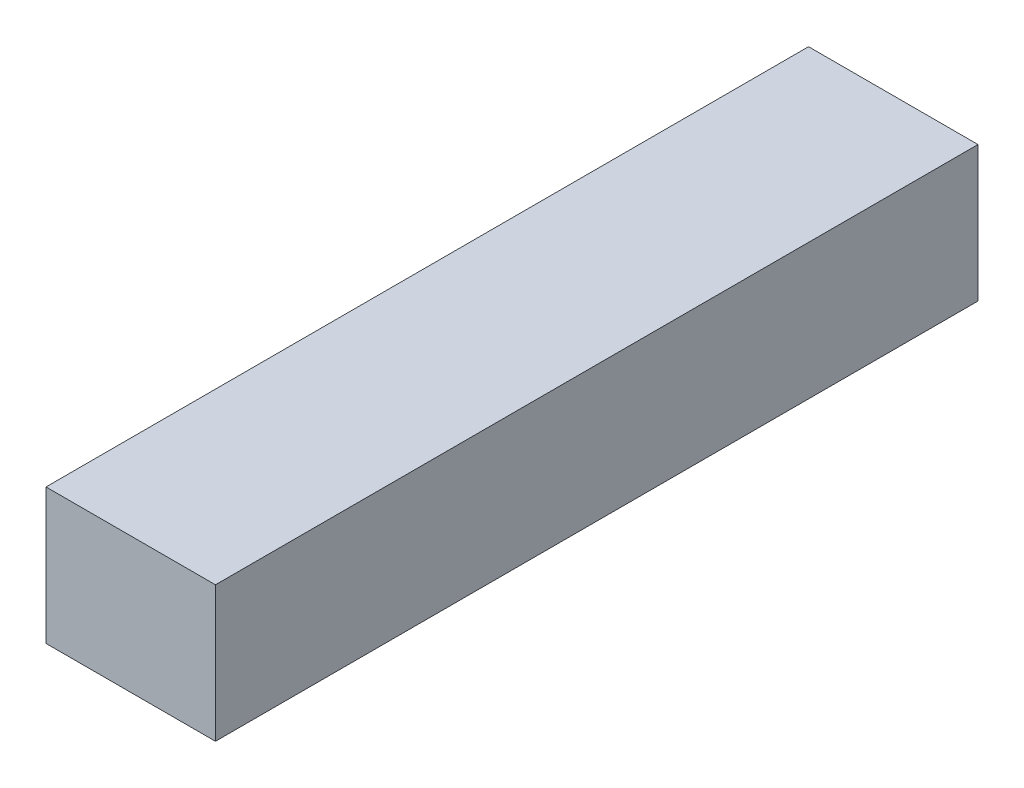
ISO-10303-21;
HEADER;
FILE_DESCRIPTION(('STEP AP214'),'2;1');
FILE_NAME('part.step','',(''),(''),'','','');
FILE_SCHEMA(('AUTOMOTIVE_DESIGN { 1 0 10303 214 1 1 1 1 }'));
ENDSEC;
DATA;
#1=APPLICATION_CONTEXT('core data for automotive mechanical design processes');
#2=APPLICATION_PROTOCOL_DEFINITION('international standard','automotive_design',2000,#1);
#3=PRODUCT_CONTEXT('',#1,'mechanical');
#4=PRODUCT('Part','Part','',(#3));
#5=PRODUCT_RELATED_PRODUCT_CATEGORY('part','',(#4));
#6=PRODUCT_DEFINITION_FORMATION('','',#4);
#7=PRODUCT_DEFINITION_CONTEXT('part definition',#1,'design');
#8=PRODUCT_DEFINITION('design','',#6,#7);
#9=PRODUCT_DEFINITION_SHAPE('','',#8);
#10=(LENGTH_UNIT() NAMED_UNIT(*) SI_UNIT(.MILLI.,.METRE.));
#11=(NAMED_UNIT(*) PLANE_ANGLE_UNIT() SI_UNIT($,.RADIAN.));
#12=(NAMED_UNIT(*) SI_UNIT($,.STERADIAN.) SOLID_ANGLE_UNIT());
#13=UNCERTAINTY_MEASURE_WITH_UNIT(LENGTH_MEASURE(1.E-05),#10,'distance_accuracy_value','');
#14=(GEOMETRIC_REPRESENTATION_CONTEXT(3) GLOBAL_UNCERTAINTY_ASSIGNED_CONTEXT((#13)) GLOBAL_UNIT_ASSIGNED_CONTEXT((#10,
#11,#12)) REPRESENTATION_CONTEXT('',''));
#15=CARTESIAN_POINT('',(0.,0.,0.));
#16=DIRECTION('',(0.,0.,1.));
#17=DIRECTION('',(1.,0.,0.));
#18=AXIS2_PLACEMENT_3D('',#15,#16,#17);
#19=CARTESIAN_POINT('',(0.,0.,45.));
#20=DIRECTION('',(1.,0.,0.));
#21=DIRECTION('',(0.,1.,0.));
#22=AXIS2_PLACEMENT_3D('',#19,#20,#21);
#23=PLANE('',#22);
#24=DIRECTION('',(0.,-1.,0.));
#25=VECTOR('',#24,1.);
#26=CARTESIAN_POINT('',(0.,0.,0.));
#27=LINE('',#26,#25);
#28=CARTESIAN_POINT('',(0.,0.,0.));
#29=VERTEX_POINT('',#28);
#30=CARTESIAN_POINT('',(0.,-8.,0.));
#31=VERTEX_POINT('',#30);
#32=EDGE_CURVE('E110',#29,#31,#27,.T.);
#33=ORIENTED_EDGE('',*,*,#32,.T.);
#34=DIRECTION('',(0.,0.,-1.));
#35=VECTOR('',#34,1.);
#36=CARTESIAN_POINT('',(0.,-8.,45.));
#37=LINE('',#36,#35);
#38=CARTESIAN_POINT('',(0.,-8.,45.));
#39=VERTEX_POINT('',#38);
#40=EDGE_CURVE('E11',#39,#31,#37,.T.);
#41=ORIENTED_EDGE('',*,*,#40,.F.);
#42=DIRECTION('',(0.,-1.,0.));
#43=VECTOR('',#42,1.);
#44=CARTESIAN_POINT('',(0.,0.,45.));
#45=LINE('',#44,#43);
#46=CARTESIAN_POINT('',(0.,0.,45.));
#47=VERTEX_POINT('',#46);
#48=EDGE_CURVE('E94',#47,#39,#45,.T.);
#49=ORIENTED_EDGE('',*,*,#48,.F.);
#50=DIRECTION('',(0.,0.,-1.));
#51=VECTOR('',#50,1.);
#52=CARTESIAN_POINT('',(0.,0.,45.));
#53=LINE('',#52,#51);
#54=EDGE_CURVE('E106',#47,#29,#53,.T.);
#55=ORIENTED_EDGE('',*,*,#54,.T.);
#56=EDGE_LOOP('',(#33,#41,#49,#55));
#57=FACE_BOUND('',#56,.T.);
#58=ADVANCED_FACE('F42',(#57),#23,.F.);
#59=CARTESIAN_POINT('',(0.,-8.,45.));
#60=DIRECTION('',(0.,1.,0.));
#61=DIRECTION('',(0.,0.,1.));
#62=AXIS2_PLACEMENT_3D('',#59,#60,#61);
#63=PLANE('',#62);
#64=DIRECTION('',(1.,0.,0.));
#65=VECTOR('',#64,1.);
#66=CARTESIAN_POINT('',(0.,-8.,0.));
#67=LINE('',#66,#65);
#68=CARTESIAN_POINT('',(10.,-8.,0.));
#69=VERTEX_POINT('',#68);
#70=EDGE_CURVE('E99',#31,#69,#67,.T.);
#71=ORIENTED_EDGE('',*,*,#70,.T.);
#72=DIRECTION('',(0.,0.,-1.));
#73=VECTOR('',#72,1.);
#74=CARTESIAN_POINT('',(10.,-8.,45.));
#75=LINE('',#74,#73);
#76=CARTESIAN_POINT('',(10.,-8.,45.));
#77=VERTEX_POINT('',#76);
#78=EDGE_CURVE('E51',#77,#69,#75,.T.);
#79=ORIENTED_EDGE('',*,*,#78,.F.);
#80=DIRECTION('',(1.,0.,0.));
#81=VECTOR('',#80,1.);
#82=CARTESIAN_POINT('',(0.,-8.,45.));
#83=LINE('',#82,#81);
#84=EDGE_CURVE('E89',#39,#77,#83,.T.);
#85=ORIENTED_EDGE('',*,*,#84,.F.);
#86=ORIENTED_EDGE('',*,*,#40,.T.);
#87=EDGE_LOOP('',(#71,#79,#85,#86));
#88=FACE_BOUND('',#87,.T.);
#89=ADVANCED_FACE('F98',(#88),#63,.F.);
#90=CARTESIAN_POINT('',(10.,0.,45.));
#91=DIRECTION('',(-1.,0.,0.));
#92=DIRECTION('',(0.,-1.,0.));
#93=AXIS2_PLACEMENT_3D('',#90,#91,#92);
#94=PLANE('',#93);
#95=DIRECTION('',(0.,1.,0.));
#96=VECTOR('',#95,1.);
#97=CARTESIAN_POINT('',(10.,0.,0.));
#98=LINE('',#97,#96);
#99=CARTESIAN_POINT('',(10.,0.,0.));
#100=VERTEX_POINT('',#99);
#101=EDGE_CURVE('E76',#69,#100,#98,.T.);
#102=ORIENTED_EDGE('',*,*,#101,.T.);
#103=DIRECTION('',(0.,0.,-1.));
#104=VECTOR('',#103,1.);
#105=CARTESIAN_POINT('',(10.,0.,45.));
#106=LINE('',#105,#104);
#107=CARTESIAN_POINT('',(10.,0.,45.));
#108=VERTEX_POINT('',#107);
#109=EDGE_CURVE('E101',#108,#100,#106,.T.);
#110=ORIENTED_EDGE('',*,*,#109,.F.);
#111=DIRECTION('',(0.,1.,0.));
#112=VECTOR('',#111,1.);
#113=CARTESIAN_POINT('',(10.,0.,45.));
#114=LINE('',#113,#112);
#115=EDGE_CURVE('E92',#77,#108,#114,.T.);
#116=ORIENTED_EDGE('',*,*,#115,.F.);
#117=ORIENTED_EDGE('',*,*,#78,.T.);
#118=EDGE_LOOP('',(#102,#110,#116,#117));
#119=FACE_BOUND('',#118,.T.);
#120=ADVANCED_FACE('F102',(#119),#94,.F.);
#121=CARTESIAN_POINT('',(0.,0.,45.));
#122=DIRECTION('',(0.,-1.,0.));
#123=DIRECTION('',(0.,0.,-1.));
#124=AXIS2_PLACEMENT_3D('',#121,#122,#123);
#125=PLANE('',#124);
#126=DIRECTION('',(-1.,0.,0.));
#127=VECTOR('',#126,1.);
#128=CARTESIAN_POINT('',(0.,0.,0.));
#129=LINE('',#128,#127);
#130=EDGE_CURVE('E82',#100,#29,#129,.T.);
#131=ORIENTED_EDGE('',*,*,#130,.T.);
#132=ORIENTED_EDGE('',*,*,#54,.F.);
#133=DIRECTION('',(-1.,0.,0.));
#134=VECTOR('',#133,1.);
#135=CARTESIAN_POINT('',(0.,0.,45.));
#136=LINE('',#135,#134);
#137=EDGE_CURVE('E59',#108,#47,#136,.T.);
#138=ORIENTED_EDGE('',*,*,#137,.F.);
#139=ORIENTED_EDGE('',*,*,#109,.T.);
#140=EDGE_LOOP('',(#131,#132,#138,#139));
#141=FACE_BOUND('',#140,.T.);
#142=ADVANCED_FACE('F123',(#141),#125,.F.);
#143=CARTESIAN_POINT('',(0.,0.,45.));
#144=DIRECTION('',(0.,0.,1.));
#145=DIRECTION('',(1.,0.,0.));
#146=AXIS2_PLACEMENT_3D('',#143,#144,#145);
#147=PLANE('',#146);
#148=ORIENTED_EDGE('',*,*,#48,.T.);
#149=ORIENTED_EDGE('',*,*,#84,.T.);
#150=ORIENTED_EDGE('',*,*,#115,.T.);
#151=ORIENTED_EDGE('',*,*,#137,.T.);
#152=EDGE_LOOP('',(#148,#149,#150,#151));
#153=FACE_BOUND('',#152,.T.);
#154=ADVANCED_FACE('F90',(#153),#147,.T.);
#155=CARTESIAN_POINT('',(0.,0.,0.));
#156=DIRECTION('',(0.,0.,1.));
#157=DIRECTION('',(1.,0.,0.));
#158=AXIS2_PLACEMENT_3D('',#155,#156,#157);
#159=PLANE('',#158);
#160=ORIENTED_EDGE('',*,*,#32,.F.);
#161=ORIENTED_EDGE('',*,*,#130,.F.);
#162=ORIENTED_EDGE('',*,*,#101,.F.);
#163=ORIENTED_EDGE('',*,*,#70,.F.);
#164=EDGE_LOOP('',(#160,#161,#162,#163));
#165=FACE_BOUND('',#164,.T.);
#166=ADVANCED_FACE('F126',(#165),#159,.F.);
#167=CLOSED_SHELL('',(#58,#89,#120,#142,#154,#166));
#168=MANIFOLD_SOLID_BREP('B2',#167);
#169=ADVANCED_BREP_SHAPE_REPRESENTATION('',(#18,#168),#14);
#170=SHAPE_DEFINITION_REPRESENTATION(#9,#169);
ENDSEC;
END-ISO-10303-21;
